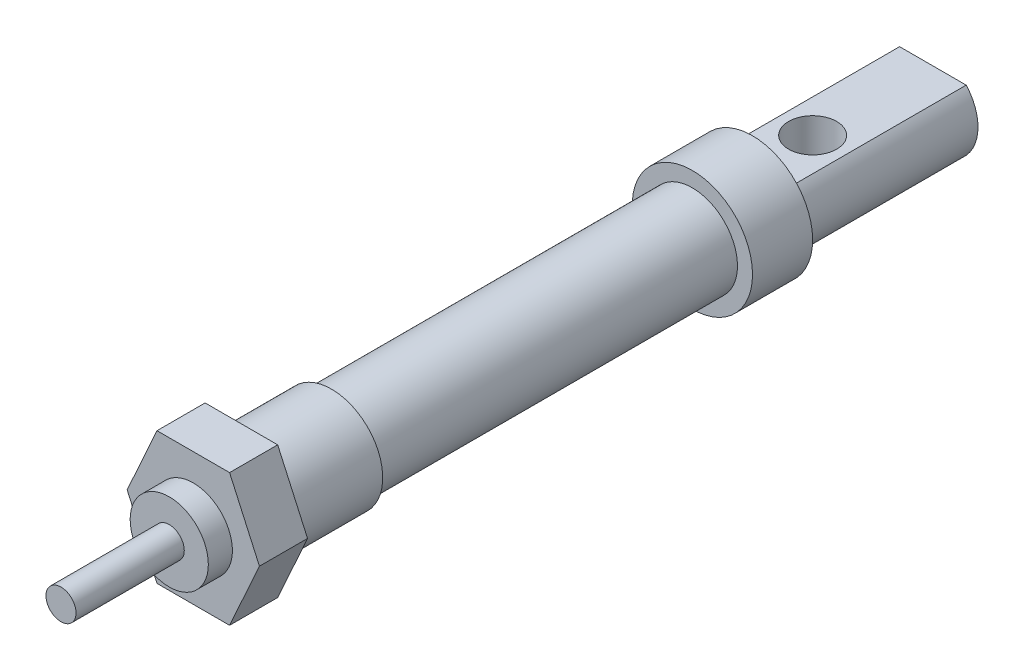
ISO-10303-21;
HEADER;
FILE_DESCRIPTION(('STEP AP214'),'2;1');
FILE_NAME('part.step','',(''),(''),'','','');
FILE_SCHEMA(('AUTOMOTIVE_DESIGN { 1 0 10303 214 1 1 1 1 }'));
ENDSEC;
DATA;
#1=APPLICATION_CONTEXT('core data for automotive mechanical design processes');
#2=APPLICATION_PROTOCOL_DEFINITION('international standard','automotive_design',2000,#1);
#3=PRODUCT_CONTEXT('',#1,'mechanical');
#4=PRODUCT('Part','Part','',(#3));
#5=PRODUCT_RELATED_PRODUCT_CATEGORY('part','',(#4));
#6=PRODUCT_DEFINITION_FORMATION('','',#4);
#7=PRODUCT_DEFINITION_CONTEXT('part definition',#1,'design');
#8=PRODUCT_DEFINITION('design','',#6,#7);
#9=PRODUCT_DEFINITION_SHAPE('','',#8);
#10=(LENGTH_UNIT() NAMED_UNIT(*) SI_UNIT(.MILLI.,.METRE.));
#11=(NAMED_UNIT(*) PLANE_ANGLE_UNIT() SI_UNIT($,.RADIAN.));
#12=(NAMED_UNIT(*) SI_UNIT($,.STERADIAN.) SOLID_ANGLE_UNIT());
#13=UNCERTAINTY_MEASURE_WITH_UNIT(LENGTH_MEASURE(1.E-05),#10,'distance_accuracy_value','');
#14=(GEOMETRIC_REPRESENTATION_CONTEXT(3) GLOBAL_UNCERTAINTY_ASSIGNED_CONTEXT((#13)) GLOBAL_UNIT_ASSIGNED_CONTEXT((#10,
#11,#12)) REPRESENTATION_CONTEXT('',''));
#15=CARTESIAN_POINT('',(0.,0.,0.));
#16=DIRECTION('',(0.,0.,1.));
#17=DIRECTION('',(1.,0.,0.));
#18=AXIS2_PLACEMENT_3D('',#15,#16,#17);
#19=CARTESIAN_POINT('',(0.,0.,38.1));
#20=DIRECTION('',(0.,0.,-1.));
#21=DIRECTION('',(-1.,0.,0.));
#22=AXIS2_PLACEMENT_3D('',#19,#20,#21);
#23=CYLINDRICAL_SURFACE('',#22,9.525);
#24=DIRECTION('',(0.,0.,-1.));
#25=VECTOR('',#24,1.);
#26=CARTESIAN_POINT('',(-7.03347032638822,-6.42307715723674,38.1));
#27=LINE('',#26,#25);
#28=CARTESIAN_POINT('',(-7.03347032638822,-6.42307715723674,38.1));
#29=VERTEX_POINT('',#28);
#30=CARTESIAN_POINT('',(-7.03347032638822,-6.42307715723674,0.));
#31=VERTEX_POINT('',#30);
#32=EDGE_CURVE('E49',#29,#31,#27,.T.);
#33=ORIENTED_EDGE('',*,*,#32,.F.);
#34=CARTESIAN_POINT('',(0.,0.,38.1));
#35=DIRECTION('',(0.,0.,1.));
#36=DIRECTION('',(1.,0.,0.));
#37=AXIS2_PLACEMENT_3D('',#34,#35,#36);
#38=CIRCLE('',#37,9.525);
#39=CARTESIAN_POINT('',(-7.03347032638822,6.42307715723674,38.1));
#40=VERTEX_POINT('',#39);
#41=EDGE_CURVE('E41',#40,#29,#38,.T.);
#42=ORIENTED_EDGE('',*,*,#41,.F.);
#43=DIRECTION('',(0.,0.,-1.));
#44=VECTOR('',#43,1.);
#45=CARTESIAN_POINT('',(-7.03347032638822,6.42307715723674,38.1));
#46=LINE('',#45,#44);
#47=CARTESIAN_POINT('',(-7.03347032638822,6.42307715723674,0.));
#48=VERTEX_POINT('',#47);
#49=EDGE_CURVE('E136',#40,#48,#46,.T.);
#50=ORIENTED_EDGE('',*,*,#49,.T.);
#51=CARTESIAN_POINT('',(0.,0.,0.));
#52=DIRECTION('',(0.,0.,1.));
#53=DIRECTION('',(1.,0.,0.));
#54=AXIS2_PLACEMENT_3D('',#51,#52,#53);
#55=CIRCLE('',#54,9.525);
#56=EDGE_CURVE('E127',#48,#31,#55,.T.);
#57=ORIENTED_EDGE('',*,*,#56,.T.);
#58=EDGE_LOOP('',(#33,#42,#50,#57));
#59=FACE_BOUND('',#58,.T.);
#60=ADVANCED_FACE('F33',(#59),#23,.T.);
#61=DIRECTION('',(0.,0.,-1.));
#62=VECTOR('',#61,1.);
#63=CARTESIAN_POINT('',(7.03347032638822,-6.42307715723674,38.1));
#64=LINE('',#63,#62);
#65=CARTESIAN_POINT('',(7.03347032638822,-6.42307715723674,38.1));
#66=VERTEX_POINT('',#65);
#67=CARTESIAN_POINT('',(7.03347032638822,-6.42307715723674,0.));
#68=VERTEX_POINT('',#67);
#69=EDGE_CURVE('E120',#66,#68,#64,.T.);
#70=ORIENTED_EDGE('',*,*,#69,.T.);
#71=CARTESIAN_POINT('',(7.03347032638822,6.42307715723674,0.));
#72=VERTEX_POINT('',#71);
#73=EDGE_CURVE('E57',#68,#72,#55,.T.);
#74=ORIENTED_EDGE('',*,*,#73,.T.);
#75=DIRECTION('',(0.,0.,-1.));
#76=VECTOR('',#75,1.);
#77=CARTESIAN_POINT('',(7.03347032638822,6.42307715723674,38.1));
#78=LINE('',#77,#76);
#79=CARTESIAN_POINT('',(7.03347032638822,6.42307715723674,38.1));
#80=VERTEX_POINT('',#79);
#81=EDGE_CURVE('E126',#80,#72,#78,.T.);
#82=ORIENTED_EDGE('',*,*,#81,.F.);
#83=EDGE_CURVE('E117',#66,#80,#38,.T.);
#84=ORIENTED_EDGE('',*,*,#83,.F.);
#85=EDGE_LOOP('',(#70,#74,#82,#84));
#86=FACE_BOUND('',#85,.T.);
#87=ADVANCED_FACE('F125',(#86),#23,.T.);
#88=CARTESIAN_POINT('',(0.,0.,0.));
#89=DIRECTION('',(0.,0.,1.));
#90=DIRECTION('',(1.,0.,0.));
#91=AXIS2_PLACEMENT_3D('',#88,#89,#90);
#92=PLANE('',#91);
#93=DIRECTION('',(-1.,0.,0.));
#94=VECTOR('',#93,1.);
#95=CARTESIAN_POINT('',(7.03347032638822,-6.42307715723674,0.));
#96=LINE('',#95,#94);
#97=EDGE_CURVE('E121',#68,#31,#96,.T.);
#98=ORIENTED_EDGE('',*,*,#97,.T.);
#99=ORIENTED_EDGE('',*,*,#56,.F.);
#100=DIRECTION('',(-1.,0.,0.));
#101=VECTOR('',#100,1.);
#102=CARTESIAN_POINT('',(7.03347032638822,6.42307715723674,0.));
#103=LINE('',#102,#101);
#104=EDGE_CURVE('E146',#72,#48,#103,.T.);
#105=ORIENTED_EDGE('',*,*,#104,.F.);
#106=ORIENTED_EDGE('',*,*,#73,.F.);
#107=EDGE_LOOP('',(#98,#99,#105,#106));
#108=FACE_BOUND('',#107,.T.);
#109=ADVANCED_FACE('F245',(#108),#92,.F.);
#110=CARTESIAN_POINT('',(0.,22.86,25.4));
#111=DIRECTION('',(0.,-1.,0.));
#112=DIRECTION('',(0.,0.,-1.));
#113=AXIS2_PLACEMENT_3D('',#110,#111,#112);
#114=CYLINDRICAL_SURFACE('',#113,5.08);
#115=CARTESIAN_POINT('',(0.,6.42307715723674,25.4));
#116=DIRECTION('',(0.,-1.,0.));
#117=DIRECTION('',(0.,0.,-1.));
#118=AXIS2_PLACEMENT_3D('',#115,#116,#117);
#119=CIRCLE('',#118,5.08);
#120=CARTESIAN_POINT('',(0.,6.42307715723674,20.32));
#121=VERTEX_POINT('',#120);
#122=EDGE_CURVE('E134',#121,#121,#119,.T.);
#123=CARTESIAN_POINT('',(0.,-6.42307715723674,25.4));
#124=DIRECTION('',(0.,-1.,0.));
#125=DIRECTION('',(0.,0.,-1.));
#126=AXIS2_PLACEMENT_3D('',#123,#124,#125);
#127=CIRCLE('',#126,5.08);
#128=CARTESIAN_POINT('',(0.,-6.42307715723674,20.32));
#129=VERTEX_POINT('',#128);
#130=EDGE_CURVE('E36',#129,#129,#127,.T.);
#131=CARTESIAN_POINT('',(0.,6.42307715723674,20.32));
#132=CARTESIAN_POINT('',(0.,6.2892630497943,20.32));
#133=CARTESIAN_POINT('',(0.,6.15544894235187,20.32));
#134=CARTESIAN_POINT('',(0.,5.88782072746701,20.32));
#135=CARTESIAN_POINT('',(0.,5.75400662002458,20.32));
#136=CARTESIAN_POINT('',(0.,5.48637840513971,20.32));
#137=CARTESIAN_POINT('',(0.,5.35256429769728,20.32));
#138=CARTESIAN_POINT('',(0.,5.08493608281242,20.32));
#139=CARTESIAN_POINT('',(0.,4.95112197536998,20.32));
#140=CARTESIAN_POINT('',(0.,4.68349376048512,20.32));
#141=CARTESIAN_POINT('',(0.,4.54967965304269,20.32));
#142=CARTESIAN_POINT('',(0.,4.28205143815782,20.32));
#143=CARTESIAN_POINT('',(0.,4.14823733071539,20.32));
#144=CARTESIAN_POINT('',(0.,3.88060911583053,20.32));
#145=CARTESIAN_POINT('',(0.,3.7467950083881,20.32));
#146=CARTESIAN_POINT('',(0.,3.47916679350323,20.32));
#147=CARTESIAN_POINT('',(0.,3.3453526860608,20.32));
#148=CARTESIAN_POINT('',(0.,3.07772447117594,20.32));
#149=CARTESIAN_POINT('',(0.,2.9439103637335,20.32));
#150=CARTESIAN_POINT('',(0.,2.67628214884864,20.32));
#151=CARTESIAN_POINT('',(0.,2.54246804140621,20.32));
#152=CARTESIAN_POINT('',(0.,2.27483982652135,20.32));
#153=CARTESIAN_POINT('',(0.,2.14102571907891,20.32));
#154=CARTESIAN_POINT('',(0.,1.87339750419405,20.32));
#155=CARTESIAN_POINT('',(0.,1.73958339675162,20.32));
#156=CARTESIAN_POINT('',(0.,1.47195518186675,20.32));
#157=CARTESIAN_POINT('',(0.,1.33814107442432,20.32));
#158=CARTESIAN_POINT('',(0.,1.07051285953946,20.32));
#159=CARTESIAN_POINT('',(0.,0.936698752097023,20.32));
#160=CARTESIAN_POINT('',(0.,0.669070537212159,20.32));
#161=CARTESIAN_POINT('',(0.,0.535256429769727,20.32));
#162=CARTESIAN_POINT('',(0.,0.267628214884863,20.32));
#163=CARTESIAN_POINT('',(0.,0.133814107442432,20.32));
#164=CARTESIAN_POINT('',(0.,-0.133814107442432,20.32));
#165=CARTESIAN_POINT('',(0.,-0.267628214884863,20.32));
#166=CARTESIAN_POINT('',(0.,-0.535256429769727,20.32));
#167=CARTESIAN_POINT('',(0.,-0.669070537212159,20.32));
#168=CARTESIAN_POINT('',(0.,-0.936698752097023,20.32));
#169=CARTESIAN_POINT('',(0.,-1.07051285953946,20.32));
#170=CARTESIAN_POINT('',(0.,-1.33814107442432,20.32));
#171=CARTESIAN_POINT('',(0.,-1.47195518186675,20.32));
#172=CARTESIAN_POINT('',(0.,-1.73958339675162,20.32));
#173=CARTESIAN_POINT('',(0.,-1.87339750419405,20.32));
#174=CARTESIAN_POINT('',(0.,-2.14102571907891,20.32));
#175=CARTESIAN_POINT('',(0.,-2.27483982652135,20.32));
#176=CARTESIAN_POINT('',(0.,-2.54246804140621,20.32));
#177=CARTESIAN_POINT('',(0.,-2.67628214884864,20.32));
#178=CARTESIAN_POINT('',(0.,-2.9439103637335,20.32));
#179=CARTESIAN_POINT('',(0.,-3.07772447117594,20.32));
#180=CARTESIAN_POINT('',(0.,-3.3453526860608,20.32));
#181=CARTESIAN_POINT('',(0.,-3.47916679350323,20.32));
#182=CARTESIAN_POINT('',(0.,-3.7467950083881,20.32));
#183=CARTESIAN_POINT('',(0.,-3.88060911583053,20.32));
#184=CARTESIAN_POINT('',(0.,-4.14823733071539,20.32));
#185=CARTESIAN_POINT('',(0.,-4.28205143815782,20.32));
#186=CARTESIAN_POINT('',(0.,-4.54967965304269,20.32));
#187=CARTESIAN_POINT('',(0.,-4.68349376048512,20.32));
#188=CARTESIAN_POINT('',(0.,-4.95112197536998,20.32));
#189=CARTESIAN_POINT('',(0.,-5.08493608281242,20.32));
#190=CARTESIAN_POINT('',(0.,-5.35256429769728,20.32));
#191=CARTESIAN_POINT('',(0.,-5.48637840513971,20.32));
#192=CARTESIAN_POINT('',(0.,-5.75400662002458,20.32));
#193=CARTESIAN_POINT('',(0.,-5.88782072746701,20.32));
#194=CARTESIAN_POINT('',(0.,-6.15544894235187,20.32));
#195=CARTESIAN_POINT('',(0.,-6.2892630497943,20.32));
#196=CARTESIAN_POINT('',(0.,-6.42307715723674,20.32));
#197=B_SPLINE_CURVE_WITH_KNOTS('',3,(#131,#132,#133,#134,#135,#136,#137,#138,#139,#140,#141,
#142,#143,#144,#145,#146,#147,#148,#149,#150,#151,#152,#153,#154,#155,#156,#157,#158,#159,#160,
#161,#162,#163,#164,#165,#166,#167,#168,#169,#170,#171,#172,#173,#174,#175,#176,#177,#178,#179,
#180,#181,#182,#183,#184,#185,#186,#187,#188,#189,#190,#191,#192,#193,#194,#195,#196),
.UNSPECIFIED.,.F.,.F.,(4,2,2,2,2,2,2,2,2,2,2,2,2,2,2,2,2,2,2,2,2,2,2,2,2,2,2,2,2,2,2,2,4),(0.,
0.401442322327295,0.80288464465459,1.20432696698189,1.60576928930918,2.00721161163648,
2.40865393396378,2.81009625629107,3.21153857861837,3.61298090094566,4.01442322327296,
4.41586554560026,4.81730786792755,5.21875019025485,5.62019251258215,6.02163483490944,
6.42307715723674,6.82451947956403,7.22596180189133,7.62740412421863,8.02884644654592,
8.43028876887322,8.83173109120052,9.23317341352781,9.63461573585511,10.0360580581824,
10.4375003805097,10.838942702837,11.2403850251643,11.6418273474916,12.0432696698189,
12.4447119921462,12.8461543144735),.UNSPECIFIED.);
#198=EDGE_CURVE('BSEAM265',#121,#129,#197,.T.);
#199=ORIENTED_EDGE('',*,*,#122,.F.);
#200=ORIENTED_EDGE('',*,*,#130,.T.);
#201=ORIENTED_EDGE('',*,*,#198,.T.);
#202=ORIENTED_EDGE('',*,*,#198,.F.);
#203=EDGE_LOOP('',(#199,#201,#200,#202));
#204=FACE_BOUND('',#203,.T.);
#205=ADVANCED_FACE('F265',(#204),#114,.F.);
#206=CARTESIAN_POINT('',(0.,0.,50.8));
#207=DIRECTION('',(0.,0.,-1.));
#208=DIRECTION('',(-1.,0.,0.));
#209=AXIS2_PLACEMENT_3D('',#206,#207,#208);
#210=CYLINDRICAL_SURFACE('',#209,12.7);
#211=CARTESIAN_POINT('',(0.,0.,50.8));
#212=DIRECTION('',(0.,0.,1.));
#213=DIRECTION('',(1.,0.,0.));
#214=AXIS2_PLACEMENT_3D('',#211,#212,#213);
#215=CIRCLE('',#214,12.7);
#216=CARTESIAN_POINT('',(12.7,0.,50.8));
#217=VERTEX_POINT('',#216);
#218=EDGE_CURVE('E217',#217,#217,#215,.T.);
#219=ORIENTED_EDGE('',*,*,#218,.F.);
#220=EDGE_LOOP('',(#219));
#221=FACE_BOUND('',#220,.T.);
#222=CARTESIAN_POINT('',(0.,0.,38.1));
#223=DIRECTION('',(0.,0.,1.));
#224=DIRECTION('',(1.,0.,0.));
#225=AXIS2_PLACEMENT_3D('',#222,#223,#224);
#226=CIRCLE('',#225,12.7);
#227=CARTESIAN_POINT('',(12.7,0.,38.1));
#228=VERTEX_POINT('',#227);
#229=EDGE_CURVE('E132',#228,#228,#226,.T.);
#230=ORIENTED_EDGE('',*,*,#229,.T.);
#231=EDGE_LOOP('',(#230));
#232=FACE_BOUND('',#231,.T.);
#233=ADVANCED_FACE('F224',(#221,#232),#210,.T.);
#234=CARTESIAN_POINT('',(0.,0.,50.8));
#235=DIRECTION('',(0.,0.,1.));
#236=DIRECTION('',(1.,0.,0.));
#237=AXIS2_PLACEMENT_3D('',#234,#235,#236);
#238=PLANE('',#237);
#239=CARTESIAN_POINT('',(0.,0.,50.8));
#240=DIRECTION('',(0.,0.,1.));
#241=DIRECTION('',(1.,0.,0.));
#242=AXIS2_PLACEMENT_3D('',#239,#240,#241);
#243=CIRCLE('',#242,9.525);
#244=CARTESIAN_POINT('',(-9.525,0.,50.8));
#245=VERTEX_POINT('',#244);
#246=EDGE_CURVE('E210',#245,#245,#243,.T.);
#247=ORIENTED_EDGE('',*,*,#246,.F.);
#248=EDGE_LOOP('',(#247));
#249=FACE_BOUND('',#248,.T.);
#250=ORIENTED_EDGE('',*,*,#218,.T.);
#251=EDGE_LOOP('',(#250));
#252=FACE_BOUND('',#251,.T.);
#253=ADVANCED_FACE('F228',(#249,#252),#238,.T.);
#254=CARTESIAN_POINT('',(0.,0.,38.1));
#255=DIRECTION('',(0.,0.,1.));
#256=DIRECTION('',(1.,0.,0.));
#257=AXIS2_PLACEMENT_3D('',#254,#255,#256);
#258=PLANE('',#257);
#259=ORIENTED_EDGE('',*,*,#229,.F.);
#260=EDGE_LOOP('',(#259));
#261=FACE_BOUND('',#260,.T.);
#262=ORIENTED_EDGE('',*,*,#41,.T.);
#263=DIRECTION('',(-1.,0.,0.));
#264=VECTOR('',#263,1.);
#265=CARTESIAN_POINT('',(7.03347032638822,-6.42307715723674,38.1));
#266=LINE('',#265,#264);
#267=EDGE_CURVE('E112',#66,#29,#266,.T.);
#268=ORIENTED_EDGE('',*,*,#267,.F.);
#269=ORIENTED_EDGE('',*,*,#83,.T.);
#270=DIRECTION('',(-1.,0.,0.));
#271=VECTOR('',#270,1.);
#272=CARTESIAN_POINT('',(7.03347032638822,6.42307715723674,38.1));
#273=LINE('',#272,#271);
#274=EDGE_CURVE('E142',#80,#40,#273,.T.);
#275=ORIENTED_EDGE('',*,*,#274,.T.);
#276=EDGE_LOOP('',(#262,#268,#269,#275));
#277=FACE_BOUND('',#276,.T.);
#278=ADVANCED_FACE('F114',(#261,#277),#258,.F.);
#279=CARTESIAN_POINT('',(0.,0.,127.));
#280=DIRECTION('',(0.,0.,-1.));
#281=DIRECTION('',(-1.,0.,0.));
#282=AXIS2_PLACEMENT_3D('',#279,#280,#281);
#283=CYLINDRICAL_SURFACE('',#282,9.525);
#284=CARTESIAN_POINT('',(0.,0.,127.));
#285=DIRECTION('',(0.,0.,1.));
#286=DIRECTION('',(1.,0.,0.));
#287=AXIS2_PLACEMENT_3D('',#284,#285,#286);
#288=CIRCLE('',#287,9.525);
#289=CARTESIAN_POINT('',(-9.525,0.,127.));
#290=VERTEX_POINT('',#289);
#291=EDGE_CURVE('E213',#290,#290,#288,.T.);
#292=CARTESIAN_POINT('',(-9.525,0.,127.));
#293=CARTESIAN_POINT('',(-9.525,0.,126.20625));
#294=CARTESIAN_POINT('',(-9.525,0.,125.4125));
#295=CARTESIAN_POINT('',(-9.525,0.,123.825));
#296=CARTESIAN_POINT('',(-9.525,0.,123.03125));
#297=CARTESIAN_POINT('',(-9.525,0.,121.44375));
#298=CARTESIAN_POINT('',(-9.525,0.,120.65));
#299=CARTESIAN_POINT('',(-9.525,0.,119.0625));
#300=CARTESIAN_POINT('',(-9.525,0.,118.26875));
#301=CARTESIAN_POINT('',(-9.525,0.,116.68125));
#302=CARTESIAN_POINT('',(-9.525,0.,115.8875));
#303=CARTESIAN_POINT('',(-9.525,0.,114.3));
#304=CARTESIAN_POINT('',(-9.525,0.,113.50625));
#305=CARTESIAN_POINT('',(-9.525,0.,111.91875));
#306=CARTESIAN_POINT('',(-9.525,0.,111.125));
#307=CARTESIAN_POINT('',(-9.525,0.,109.5375));
#308=CARTESIAN_POINT('',(-9.525,0.,108.74375));
#309=CARTESIAN_POINT('',(-9.525,0.,107.15625));
#310=CARTESIAN_POINT('',(-9.525,0.,106.3625));
#311=CARTESIAN_POINT('',(-9.525,0.,104.775));
#312=CARTESIAN_POINT('',(-9.525,0.,103.98125));
#313=CARTESIAN_POINT('',(-9.525,0.,102.39375));
#314=CARTESIAN_POINT('',(-9.525,0.,101.6));
#315=CARTESIAN_POINT('',(-9.525,0.,100.0125));
#316=CARTESIAN_POINT('',(-9.525,0.,99.21875));
#317=CARTESIAN_POINT('',(-9.525,0.,97.63125));
#318=CARTESIAN_POINT('',(-9.525,0.,96.8375));
#319=CARTESIAN_POINT('',(-9.525,0.,95.25));
#320=CARTESIAN_POINT('',(-9.525,0.,94.45625));
#321=CARTESIAN_POINT('',(-9.525,0.,92.86875));
#322=CARTESIAN_POINT('',(-9.525,0.,92.075));
#323=CARTESIAN_POINT('',(-9.525,0.,90.4875));
#324=CARTESIAN_POINT('',(-9.525,0.,89.69375));
#325=CARTESIAN_POINT('',(-9.525,0.,88.10625));
#326=CARTESIAN_POINT('',(-9.525,0.,87.3125));
#327=CARTESIAN_POINT('',(-9.525,0.,85.725));
#328=CARTESIAN_POINT('',(-9.525,0.,84.93125));
#329=CARTESIAN_POINT('',(-9.525,0.,83.34375));
#330=CARTESIAN_POINT('',(-9.525,0.,82.55));
#331=CARTESIAN_POINT('',(-9.525,0.,80.9625));
#332=CARTESIAN_POINT('',(-9.525,0.,80.16875));
#333=CARTESIAN_POINT('',(-9.525,0.,78.58125));
#334=CARTESIAN_POINT('',(-9.525,0.,77.7875));
#335=CARTESIAN_POINT('',(-9.525,0.,76.2));
#336=CARTESIAN_POINT('',(-9.525,0.,75.40625));
#337=CARTESIAN_POINT('',(-9.525,0.,73.81875));
#338=CARTESIAN_POINT('',(-9.525,0.,73.025));
#339=CARTESIAN_POINT('',(-9.525,0.,71.4375));
#340=CARTESIAN_POINT('',(-9.525,0.,70.64375));
#341=CARTESIAN_POINT('',(-9.525,0.,69.05625));
#342=CARTESIAN_POINT('',(-9.525,0.,68.2625));
#343=CARTESIAN_POINT('',(-9.525,0.,66.675));
#344=CARTESIAN_POINT('',(-9.525,0.,65.88125));
#345=CARTESIAN_POINT('',(-9.525,0.,64.29375));
#346=CARTESIAN_POINT('',(-9.525,0.,63.5));
#347=CARTESIAN_POINT('',(-9.525,0.,61.9125));
#348=CARTESIAN_POINT('',(-9.525,0.,61.11875));
#349=CARTESIAN_POINT('',(-9.525,0.,59.53125));
#350=CARTESIAN_POINT('',(-9.525,0.,58.7375));
#351=CARTESIAN_POINT('',(-9.525,0.,57.15));
#352=CARTESIAN_POINT('',(-9.525,0.,56.35625));
#353=CARTESIAN_POINT('',(-9.525,0.,54.76875));
#354=CARTESIAN_POINT('',(-9.525,0.,53.975));
#355=CARTESIAN_POINT('',(-9.525,0.,52.3875));
#356=CARTESIAN_POINT('',(-9.525,0.,51.59375));
#357=CARTESIAN_POINT('',(-9.525,0.,50.8));
#358=B_SPLINE_CURVE_WITH_KNOTS('',3,(#292,#293,#294,#295,#296,#297,#298,#299,#300,#301,#302,
#303,#304,#305,#306,#307,#308,#309,#310,#311,#312,#313,#314,#315,#316,#317,#318,#319,#320,#321,
#322,#323,#324,#325,#326,#327,#328,#329,#330,#331,#332,#333,#334,#335,#336,#337,#338,#339,#340,
#341,#342,#343,#344,#345,#346,#347,#348,#349,#350,#351,#352,#353,#354,#355,#356,#357),
.UNSPECIFIED.,.F.,.F.,(4,2,2,2,2,2,2,2,2,2,2,2,2,2,2,2,2,2,2,2,2,2,2,2,2,2,2,2,2,2,2,2,4),(0.,
2.38125000000002,4.76250000000002,7.14375000000002,9.52500000000001,11.90625,14.2875,16.66875,
19.05,21.43125,23.8125,26.19375,28.575,30.95625,33.3375,35.71875,38.1,40.48125,42.8625,45.24375,
47.625,50.00625,52.3875,54.76875,57.15,59.53125,61.9125,64.29375,66.675,69.05625,71.4375,
73.81875,76.2),.UNSPECIFIED.);
#359=EDGE_CURVE('BSEAM227',#290,#245,#358,.T.);
#360=ORIENTED_EDGE('',*,*,#291,.F.);
#361=ORIENTED_EDGE('',*,*,#246,.T.);
#362=ORIENTED_EDGE('',*,*,#359,.T.);
#363=ORIENTED_EDGE('',*,*,#359,.F.);
#364=EDGE_LOOP('',(#360,#362,#361,#363));
#365=FACE_BOUND('',#364,.T.);
#366=ADVANCED_FACE('F227',(#365),#283,.T.);
#367=CARTESIAN_POINT('',(0.,0.,146.05));
#368=DIRECTION('',(0.,0.,-1.));
#369=DIRECTION('',(-1.,0.,0.));
#370=AXIS2_PLACEMENT_3D('',#367,#368,#369);
#371=CYLINDRICAL_SURFACE('',#370,10.7950000000001);
#372=CARTESIAN_POINT('',(0.,0.,146.05));
#373=DIRECTION('',(0.,0.,1.));
#374=DIRECTION('',(1.,0.,0.));
#375=AXIS2_PLACEMENT_3D('',#372,#373,#374);
#376=CIRCLE('',#375,10.7950000000001);
#377=CARTESIAN_POINT('',(-10.7950000000001,0.,146.05));
#378=VERTEX_POINT('',#377);
#379=EDGE_CURVE('E207',#378,#378,#376,.T.);
#380=CARTESIAN_POINT('',(0.,0.,127.));
#381=DIRECTION('',(0.,0.,1.));
#382=DIRECTION('',(1.,0.,0.));
#383=AXIS2_PLACEMENT_3D('',#380,#381,#382);
#384=CIRCLE('',#383,10.7950000000001);
#385=CARTESIAN_POINT('',(-10.7950000000001,0.,127.));
#386=VERTEX_POINT('',#385);
#387=EDGE_CURVE('E197',#386,#386,#384,.T.);
#388=CARTESIAN_POINT('',(-10.7950000000001,0.,146.05));
#389=CARTESIAN_POINT('',(-10.7950000000001,0.,145.8515625));
#390=CARTESIAN_POINT('',(-10.7950000000001,0.,145.653125));
#391=CARTESIAN_POINT('',(-10.7950000000001,0.,145.25625));
#392=CARTESIAN_POINT('',(-10.7950000000001,0.,145.0578125));
#393=CARTESIAN_POINT('',(-10.7950000000001,0.,144.6609375));
#394=CARTESIAN_POINT('',(-10.7950000000001,0.,144.4625));
#395=CARTESIAN_POINT('',(-10.7950000000001,0.,144.065625));
#396=CARTESIAN_POINT('',(-10.7950000000001,0.,143.8671875));
#397=CARTESIAN_POINT('',(-10.7950000000001,0.,143.4703125));
#398=CARTESIAN_POINT('',(-10.7950000000001,0.,143.271875));
#399=CARTESIAN_POINT('',(-10.7950000000001,0.,142.875));
#400=CARTESIAN_POINT('',(-10.7950000000001,0.,142.6765625));
#401=CARTESIAN_POINT('',(-10.7950000000001,0.,142.2796875));
#402=CARTESIAN_POINT('',(-10.7950000000001,0.,142.08125));
#403=CARTESIAN_POINT('',(-10.7950000000001,0.,141.684375));
#404=CARTESIAN_POINT('',(-10.7950000000001,0.,141.4859375));
#405=CARTESIAN_POINT('',(-10.7950000000001,0.,141.0890625));
#406=CARTESIAN_POINT('',(-10.7950000000001,0.,140.890625));
#407=CARTESIAN_POINT('',(-10.7950000000001,0.,140.49375));
#408=CARTESIAN_POINT('',(-10.7950000000001,0.,140.2953125));
#409=CARTESIAN_POINT('',(-10.7950000000001,0.,139.8984375));
#410=CARTESIAN_POINT('',(-10.7950000000001,0.,139.7));
#411=CARTESIAN_POINT('',(-10.7950000000001,0.,139.303125));
#412=CARTESIAN_POINT('',(-10.7950000000001,0.,139.1046875));
#413=CARTESIAN_POINT('',(-10.7950000000001,0.,138.7078125));
#414=CARTESIAN_POINT('',(-10.7950000000001,0.,138.509375));
#415=CARTESIAN_POINT('',(-10.7950000000001,0.,138.1125));
#416=CARTESIAN_POINT('',(-10.7950000000001,0.,137.9140625));
#417=CARTESIAN_POINT('',(-10.7950000000001,0.,137.5171875));
#418=CARTESIAN_POINT('',(-10.7950000000001,0.,137.31875));
#419=CARTESIAN_POINT('',(-10.7950000000001,0.,136.921875));
#420=CARTESIAN_POINT('',(-10.7950000000001,0.,136.7234375));
#421=CARTESIAN_POINT('',(-10.7950000000001,0.,136.3265625));
#422=CARTESIAN_POINT('',(-10.7950000000001,0.,136.128125));
#423=CARTESIAN_POINT('',(-10.7950000000001,0.,135.73125));
#424=CARTESIAN_POINT('',(-10.7950000000001,0.,135.5328125));
#425=CARTESIAN_POINT('',(-10.7950000000001,0.,135.1359375));
#426=CARTESIAN_POINT('',(-10.7950000000001,0.,134.9375));
#427=CARTESIAN_POINT('',(-10.7950000000001,0.,134.540625));
#428=CARTESIAN_POINT('',(-10.7950000000001,0.,134.3421875));
#429=CARTESIAN_POINT('',(-10.7950000000001,0.,133.9453125));
#430=CARTESIAN_POINT('',(-10.7950000000001,0.,133.746875));
#431=CARTESIAN_POINT('',(-10.7950000000001,0.,133.35));
#432=CARTESIAN_POINT('',(-10.7950000000001,0.,133.1515625));
#433=CARTESIAN_POINT('',(-10.7950000000001,0.,132.7546875));
#434=CARTESIAN_POINT('',(-10.7950000000001,0.,132.55625));
#435=CARTESIAN_POINT('',(-10.7950000000001,0.,132.159375));
#436=CARTESIAN_POINT('',(-10.7950000000001,0.,131.9609375));
#437=CARTESIAN_POINT('',(-10.7950000000001,0.,131.5640625));
#438=CARTESIAN_POINT('',(-10.7950000000001,0.,131.365625));
#439=CARTESIAN_POINT('',(-10.7950000000001,0.,130.96875));
#440=CARTESIAN_POINT('',(-10.7950000000001,0.,130.7703125));
#441=CARTESIAN_POINT('',(-10.7950000000001,0.,130.3734375));
#442=CARTESIAN_POINT('',(-10.7950000000001,0.,130.175));
#443=CARTESIAN_POINT('',(-10.7950000000001,0.,129.778125));
#444=CARTESIAN_POINT('',(-10.7950000000001,0.,129.5796875));
#445=CARTESIAN_POINT('',(-10.7950000000001,0.,129.1828125));
#446=CARTESIAN_POINT('',(-10.7950000000001,0.,128.984375));
#447=CARTESIAN_POINT('',(-10.7950000000001,0.,128.5875));
#448=CARTESIAN_POINT('',(-10.7950000000001,0.,128.3890625));
#449=CARTESIAN_POINT('',(-10.7950000000001,0.,127.9921875));
#450=CARTESIAN_POINT('',(-10.7950000000001,0.,127.79375));
#451=CARTESIAN_POINT('',(-10.7950000000001,0.,127.396875));
#452=CARTESIAN_POINT('',(-10.7950000000001,0.,127.1984375));
#453=CARTESIAN_POINT('',(-10.7950000000001,0.,127.));
#454=B_SPLINE_CURVE_WITH_KNOTS('',3,(#388,#389,#390,#391,#392,#393,#394,#395,#396,#397,#398,
#399,#400,#401,#402,#403,#404,#405,#406,#407,#408,#409,#410,#411,#412,#413,#414,#415,#416,#417,
#418,#419,#420,#421,#422,#423,#424,#425,#426,#427,#428,#429,#430,#431,#432,#433,#434,#435,#436,
#437,#438,#439,#440,#441,#442,#443,#444,#445,#446,#447,#448,#449,#450,#451,#452,#453),
.UNSPECIFIED.,.F.,.F.,(4,2,2,2,2,2,2,2,2,2,2,2,2,2,2,2,2,2,2,2,2,2,2,2,2,2,2,2,2,2,2,2,4),(0.,
0.5953125,1.190625,1.7859375,2.38125,2.9765625,3.571875,4.1671875,4.7625,5.3578125,5.953125,
6.5484375,7.14375,7.7390625,8.334375,8.92968750000001,9.52500000000001,10.1203125,10.715625,
11.3109375,11.90625,12.5015625,13.096875,13.6921875,14.2875,14.8828125,15.478125,16.0734375,
16.66875,17.2640625,17.859375,18.4546875,19.05),.UNSPECIFIED.);
#455=EDGE_CURVE('BSEAM234',#378,#386,#454,.T.);
#456=ORIENTED_EDGE('',*,*,#379,.F.);
#457=ORIENTED_EDGE('',*,*,#387,.T.);
#458=ORIENTED_EDGE('',*,*,#455,.T.);
#459=ORIENTED_EDGE('',*,*,#455,.F.);
#460=EDGE_LOOP('',(#456,#458,#457,#459));
#461=FACE_BOUND('',#460,.T.);
#462=ADVANCED_FACE('F234',(#461),#371,.T.);
#463=CARTESIAN_POINT('',(0.,0.,127.));
#464=DIRECTION('',(0.,0.,1.));
#465=DIRECTION('',(1.,0.,0.));
#466=AXIS2_PLACEMENT_3D('',#463,#464,#465);
#467=PLANE('',#466);
#468=ORIENTED_EDGE('',*,*,#291,.T.);
#469=EDGE_LOOP('',(#468));
#470=FACE_BOUND('',#469,.T.);
#471=ORIENTED_EDGE('',*,*,#387,.F.);
#472=EDGE_LOOP('',(#471));
#473=FACE_BOUND('',#472,.T.);
#474=ADVANCED_FACE('F311',(#470,#473),#467,.F.);
#475=CARTESIAN_POINT('',(-7.66371527185745,13.97,156.21));
#476=DIRECTION('',(0.,1.,0.));
#477=DIRECTION('',(-1.,0.,0.));
#478=AXIS2_PLACEMENT_3D('',#475,#476,#477);
#479=PLANE('',#478);
#480=DIRECTION('',(1.,0.,0.));
#481=VECTOR('',#480,1.);
#482=CARTESIAN_POINT('',(-7.66371527185745,13.97,146.05));
#483=LINE('',#482,#481);
#484=CARTESIAN_POINT('',(-7.66371527185745,13.97,146.05));
#485=VERTEX_POINT('',#484);
#486=CARTESIAN_POINT('',(7.66371527185745,13.97,146.05));
#487=VERTEX_POINT('',#486);
#488=EDGE_CURVE('E158',#485,#487,#483,.T.);
#489=ORIENTED_EDGE('',*,*,#488,.F.);
#490=DIRECTION('',(0.,0.,-1.));
#491=VECTOR('',#490,1.);
#492=CARTESIAN_POINT('',(-7.66371527185745,13.97,156.21));
#493=LINE('',#492,#491);
#494=CARTESIAN_POINT('',(-7.66371527185745,13.97,156.21));
#495=VERTEX_POINT('',#494);
#496=EDGE_CURVE('E195',#495,#485,#493,.T.);
#497=ORIENTED_EDGE('',*,*,#496,.F.);
#498=DIRECTION('',(1.,0.,0.));
#499=VECTOR('',#498,1.);
#500=CARTESIAN_POINT('',(-7.66371527185745,13.97,156.21));
#501=LINE('',#500,#499);
#502=CARTESIAN_POINT('',(7.66371527185745,13.97,156.21));
#503=VERTEX_POINT('',#502);
#504=EDGE_CURVE('E159',#495,#503,#501,.T.);
#505=ORIENTED_EDGE('',*,*,#504,.T.);
#506=DIRECTION('',(0.,0.,-1.));
#507=VECTOR('',#506,1.);
#508=CARTESIAN_POINT('',(7.66371527185745,13.97,156.21));
#509=LINE('',#508,#507);
#510=EDGE_CURVE('E178',#503,#487,#509,.T.);
#511=ORIENTED_EDGE('',*,*,#510,.T.);
#512=EDGE_LOOP('',(#489,#497,#505,#511));
#513=FACE_BOUND('',#512,.T.);
#514=ADVANCED_FACE('F293',(#513),#479,.T.);
#515=CARTESIAN_POINT('',(-13.97,0.,156.21));
#516=DIRECTION('',(-0.911437827766148,0.411437827766148,0.));
#517=DIRECTION('',(-0.411437827766148,-0.911437827766148,0.));
#518=AXIS2_PLACEMENT_3D('',#515,#516,#517);
#519=PLANE('',#518);
#520=DIRECTION('',(0.411437827766148,0.911437827766148,0.));
#521=VECTOR('',#520,1.);
#522=CARTESIAN_POINT('',(-13.97,0.,146.05));
#523=LINE('',#522,#521);
#524=CARTESIAN_POINT('',(-13.97,0.,146.05));
#525=VERTEX_POINT('',#524);
#526=EDGE_CURVE('E163',#525,#485,#523,.T.);
#527=ORIENTED_EDGE('',*,*,#526,.F.);
#528=DIRECTION('',(0.,0.,-1.));
#529=VECTOR('',#528,1.);
#530=CARTESIAN_POINT('',(-13.97,0.,156.21));
#531=LINE('',#530,#529);
#532=CARTESIAN_POINT('',(-13.97,0.,156.21));
#533=VERTEX_POINT('',#532);
#534=EDGE_CURVE('E198',#533,#525,#531,.T.);
#535=ORIENTED_EDGE('',*,*,#534,.F.);
#536=DIRECTION('',(0.411437827766148,0.911437827766148,0.));
#537=VECTOR('',#536,1.);
#538=CARTESIAN_POINT('',(-13.97,0.,156.21));
#539=LINE('',#538,#537);
#540=EDGE_CURVE('E175',#533,#495,#539,.T.);
#541=ORIENTED_EDGE('',*,*,#540,.T.);
#542=ORIENTED_EDGE('',*,*,#496,.T.);
#543=EDGE_LOOP('',(#527,#535,#541,#542));
#544=FACE_BOUND('',#543,.T.);
#545=ADVANCED_FACE('F289',(#544),#519,.T.);
#546=CARTESIAN_POINT('',(-7.66371527185745,-13.97,156.21));
#547=DIRECTION('',(-0.911437827766148,-0.411437827766148,0.));
#548=DIRECTION('',(0.411437827766148,-0.911437827766148,0.));
#549=AXIS2_PLACEMENT_3D('',#546,#547,#548);
#550=PLANE('',#549);
#551=DIRECTION('',(-0.411437827766148,0.911437827766148,0.));
#552=VECTOR('',#551,1.);
#553=CARTESIAN_POINT('',(-7.66371527185745,-13.97,146.05));
#554=LINE('',#553,#552);
#555=CARTESIAN_POINT('',(-7.66371527185745,-13.97,146.05));
#556=VERTEX_POINT('',#555);
#557=EDGE_CURVE('E190',#556,#525,#554,.T.);
#558=ORIENTED_EDGE('',*,*,#557,.F.);
#559=DIRECTION('',(0.,0.,-1.));
#560=VECTOR('',#559,1.);
#561=CARTESIAN_POINT('',(-7.66371527185745,-13.97,156.21));
#562=LINE('',#561,#560);
#563=CARTESIAN_POINT('',(-7.66371527185745,-13.97,156.21));
#564=VERTEX_POINT('',#563);
#565=EDGE_CURVE('E200',#564,#556,#562,.T.);
#566=ORIENTED_EDGE('',*,*,#565,.F.);
#567=DIRECTION('',(-0.411437827766148,0.911437827766148,0.));
#568=VECTOR('',#567,1.);
#569=CARTESIAN_POINT('',(-7.66371527185745,-13.97,156.21));
#570=LINE('',#569,#568);
#571=EDGE_CURVE('E172',#564,#533,#570,.T.);
#572=ORIENTED_EDGE('',*,*,#571,.T.);
#573=ORIENTED_EDGE('',*,*,#534,.T.);
#574=EDGE_LOOP('',(#558,#566,#572,#573));
#575=FACE_BOUND('',#574,.T.);
#576=ADVANCED_FACE('F292',(#575),#550,.T.);
#577=CARTESIAN_POINT('',(7.66371527185744,-13.97,156.21));
#578=DIRECTION('',(0.,-1.,0.));
#579=DIRECTION('',(0.,0.,-1.));
#580=AXIS2_PLACEMENT_3D('',#577,#578,#579);
#581=PLANE('',#580);
#582=DIRECTION('',(-1.,0.,0.));
#583=VECTOR('',#582,1.);
#584=CARTESIAN_POINT('',(7.66371527185744,-13.97,146.05));
#585=LINE('',#584,#583);
#586=CARTESIAN_POINT('',(7.66371527185744,-13.97,146.05));
#587=VERTEX_POINT('',#586);
#588=EDGE_CURVE('E187',#587,#556,#585,.T.);
#589=ORIENTED_EDGE('',*,*,#588,.F.);
#590=DIRECTION('',(0.,0.,-1.));
#591=VECTOR('',#590,1.);
#592=CARTESIAN_POINT('',(7.66371527185744,-13.97,156.21));
#593=LINE('',#592,#591);
#594=CARTESIAN_POINT('',(7.66371527185744,-13.97,156.21));
#595=VERTEX_POINT('',#594);
#596=EDGE_CURVE('E202',#595,#587,#593,.T.);
#597=ORIENTED_EDGE('',*,*,#596,.F.);
#598=DIRECTION('',(-1.,0.,0.));
#599=VECTOR('',#598,1.);
#600=CARTESIAN_POINT('',(7.66371527185744,-13.97,156.21));
#601=LINE('',#600,#599);
#602=EDGE_CURVE('E169',#595,#564,#601,.T.);
#603=ORIENTED_EDGE('',*,*,#602,.T.);
#604=ORIENTED_EDGE('',*,*,#565,.T.);
#605=EDGE_LOOP('',(#589,#597,#603,#604));
#606=FACE_BOUND('',#605,.T.);
#607=ADVANCED_FACE('F297',(#606),#581,.T.);
#608=CARTESIAN_POINT('',(13.97,0.,156.21));
#609=DIRECTION('',(0.911437827766148,-0.411437827766148,0.));
#610=DIRECTION('',(0.411437827766148,0.911437827766148,0.));
#611=AXIS2_PLACEMENT_3D('',#608,#609,#610);
#612=PLANE('',#611);
#613=DIRECTION('',(-0.411437827766148,-0.911437827766148,0.));
#614=VECTOR('',#613,1.);
#615=CARTESIAN_POINT('',(13.97,0.,146.05));
#616=LINE('',#615,#614);
#617=CARTESIAN_POINT('',(13.97,0.,146.05));
#618=VERTEX_POINT('',#617);
#619=EDGE_CURVE('E184',#618,#587,#616,.T.);
#620=ORIENTED_EDGE('',*,*,#619,.F.);
#621=DIRECTION('',(0.,0.,-1.));
#622=VECTOR('',#621,1.);
#623=CARTESIAN_POINT('',(13.97,0.,156.21));
#624=LINE('',#623,#622);
#625=CARTESIAN_POINT('',(13.97,0.,156.21));
#626=VERTEX_POINT('',#625);
#627=EDGE_CURVE('E204',#626,#618,#624,.T.);
#628=ORIENTED_EDGE('',*,*,#627,.F.);
#629=DIRECTION('',(-0.411437827766148,-0.911437827766148,0.));
#630=VECTOR('',#629,1.);
#631=CARTESIAN_POINT('',(13.97,0.,156.21));
#632=LINE('',#631,#630);
#633=EDGE_CURVE('E166',#626,#595,#632,.T.);
#634=ORIENTED_EDGE('',*,*,#633,.T.);
#635=ORIENTED_EDGE('',*,*,#596,.T.);
#636=EDGE_LOOP('',(#620,#628,#634,#635));
#637=FACE_BOUND('',#636,.T.);
#638=ADVANCED_FACE('F301',(#637),#612,.T.);
#639=CARTESIAN_POINT('',(7.66371527185745,13.97,156.21));
#640=DIRECTION('',(0.911437827766148,0.411437827766148,0.));
#641=DIRECTION('',(-0.411437827766148,0.911437827766148,0.));
#642=AXIS2_PLACEMENT_3D('',#639,#640,#641);
#643=PLANE('',#642);
#644=DIRECTION('',(0.411437827766148,-0.911437827766148,0.));
#645=VECTOR('',#644,1.);
#646=CARTESIAN_POINT('',(7.66371527185745,13.97,146.05));
#647=LINE('',#646,#645);
#648=EDGE_CURVE('E181',#487,#618,#647,.T.);
#649=ORIENTED_EDGE('',*,*,#648,.F.);
#650=ORIENTED_EDGE('',*,*,#510,.F.);
#651=DIRECTION('',(0.411437827766148,-0.911437827766148,0.));
#652=VECTOR('',#651,1.);
#653=CARTESIAN_POINT('',(7.66371527185745,13.97,156.21));
#654=LINE('',#653,#652);
#655=EDGE_CURVE('E162',#503,#626,#654,.T.);
#656=ORIENTED_EDGE('',*,*,#655,.T.);
#657=ORIENTED_EDGE('',*,*,#627,.T.);
#658=EDGE_LOOP('',(#649,#650,#656,#657));
#659=FACE_BOUND('',#658,.T.);
#660=ADVANCED_FACE('F284',(#659),#643,.T.);
#661=CARTESIAN_POINT('',(0.,0.,156.21));
#662=DIRECTION('',(0.,0.,-1.));
#663=DIRECTION('',(-1.,0.,0.));
#664=AXIS2_PLACEMENT_3D('',#661,#662,#663);
#665=PLANE('',#664);
#666=CARTESIAN_POINT('',(0.,0.,156.21));
#667=DIRECTION('',(0.,0.,-1.));
#668=DIRECTION('',(-1.,0.,0.));
#669=AXIS2_PLACEMENT_3D('',#666,#667,#668);
#670=CIRCLE('',#669,8.255);
#671=CARTESIAN_POINT('',(-8.255,0.,156.21));
#672=VERTEX_POINT('',#671);
#673=EDGE_CURVE('E11',#672,#672,#670,.F.);
#674=ORIENTED_EDGE('',*,*,#673,.F.);
#675=EDGE_LOOP('',(#674));
#676=FACE_BOUND('',#675,.T.);
#677=ORIENTED_EDGE('',*,*,#504,.F.);
#678=ORIENTED_EDGE('',*,*,#540,.F.);
#679=ORIENTED_EDGE('',*,*,#571,.F.);
#680=ORIENTED_EDGE('',*,*,#602,.F.);
#681=ORIENTED_EDGE('',*,*,#633,.F.);
#682=ORIENTED_EDGE('',*,*,#655,.F.);
#683=EDGE_LOOP('',(#677,#678,#679,#680,#681,#682));
#684=FACE_BOUND('',#683,.T.);
#685=ADVANCED_FACE('F281',(#676,#684),#665,.F.);
#686=CARTESIAN_POINT('',(0.,0.,146.05));
#687=DIRECTION('',(0.,0.,-1.));
#688=DIRECTION('',(-1.,0.,0.));
#689=AXIS2_PLACEMENT_3D('',#686,#687,#688);
#690=PLANE('',#689);
#691=ORIENTED_EDGE('',*,*,#379,.T.);
#692=EDGE_LOOP('',(#691));
#693=FACE_BOUND('',#692,.T.);
#694=ORIENTED_EDGE('',*,*,#488,.T.);
#695=ORIENTED_EDGE('',*,*,#648,.T.);
#696=ORIENTED_EDGE('',*,*,#619,.T.);
#697=ORIENTED_EDGE('',*,*,#588,.T.);
#698=ORIENTED_EDGE('',*,*,#557,.T.);
#699=ORIENTED_EDGE('',*,*,#526,.T.);
#700=EDGE_LOOP('',(#694,#695,#696,#697,#698,#699));
#701=FACE_BOUND('',#700,.T.);
#702=ADVANCED_FACE('F279',(#693,#701),#690,.T.);
#703=CARTESIAN_POINT('',(0.,0.,161.29));
#704=DIRECTION('',(0.,0.,-1.));
#705=DIRECTION('',(-1.,0.,0.));
#706=AXIS2_PLACEMENT_3D('',#703,#704,#705);
#707=CYLINDRICAL_SURFACE('',#706,8.255);
#708=CARTESIAN_POINT('',(0.,0.,161.29));
#709=DIRECTION('',(0.,0.,1.));
#710=DIRECTION('',(1.,0.,0.));
#711=AXIS2_PLACEMENT_3D('',#708,#709,#710);
#712=CIRCLE('',#711,8.255);
#713=CARTESIAN_POINT('',(8.255,0.,161.29));
#714=VERTEX_POINT('',#713);
#715=EDGE_CURVE('E153',#714,#714,#712,.T.);
#716=ORIENTED_EDGE('',*,*,#715,.F.);
#717=EDGE_LOOP('',(#716));
#718=FACE_BOUND('',#717,.T.);
#719=ORIENTED_EDGE('',*,*,#673,.T.);
#720=EDGE_LOOP('',(#719));
#721=FACE_BOUND('',#720,.T.);
#722=ADVANCED_FACE('F275',(#718,#721),#707,.T.);
#723=CARTESIAN_POINT('',(0.,0.,161.29));
#724=DIRECTION('',(0.,0.,1.));
#725=DIRECTION('',(1.,0.,0.));
#726=AXIS2_PLACEMENT_3D('',#723,#724,#725);
#727=PLANE('',#726);
#728=CARTESIAN_POINT('',(0.,0.,161.29));
#729=DIRECTION('',(0.,0.,1.));
#730=DIRECTION('',(1.,0.,0.));
#731=AXIS2_PLACEMENT_3D('',#728,#729,#730);
#732=CIRCLE('',#731,3.175);
#733=CARTESIAN_POINT('',(3.175,0.,161.29));
#734=VERTEX_POINT('',#733);
#735=EDGE_CURVE('E140',#734,#734,#732,.T.);
#736=ORIENTED_EDGE('',*,*,#735,.F.);
#737=EDGE_LOOP('',(#736));
#738=FACE_BOUND('',#737,.T.);
#739=ORIENTED_EDGE('',*,*,#715,.T.);
#740=EDGE_LOOP('',(#739));
#741=FACE_BOUND('',#740,.T.);
#742=ADVANCED_FACE('F271',(#738,#741),#727,.T.);
#743=CARTESIAN_POINT('',(0.,0.,184.15));
#744=DIRECTION('',(0.,0.,-1.));
#745=DIRECTION('',(-1.,0.,0.));
#746=AXIS2_PLACEMENT_3D('',#743,#744,#745);
#747=CYLINDRICAL_SURFACE('',#746,3.175);
#748=CARTESIAN_POINT('',(0.,0.,184.15));
#749=DIRECTION('',(0.,0.,1.));
#750=DIRECTION('',(1.,0.,0.));
#751=AXIS2_PLACEMENT_3D('',#748,#749,#750);
#752=CIRCLE('',#751,3.175);
#753=CARTESIAN_POINT('',(3.175,0.,184.15));
#754=VERTEX_POINT('',#753);
#755=EDGE_CURVE('E150',#754,#754,#752,.T.);
#756=ORIENTED_EDGE('',*,*,#755,.F.);
#757=EDGE_LOOP('',(#756));
#758=FACE_BOUND('',#757,.T.);
#759=ORIENTED_EDGE('',*,*,#735,.T.);
#760=EDGE_LOOP('',(#759));
#761=FACE_BOUND('',#760,.T.);
#762=ADVANCED_FACE('F261',(#758,#761),#747,.T.);
#763=CARTESIAN_POINT('',(0.,0.,184.15));
#764=DIRECTION('',(0.,0.,1.));
#765=DIRECTION('',(1.,0.,0.));
#766=AXIS2_PLACEMENT_3D('',#763,#764,#765);
#767=PLANE('',#766);
#768=ORIENTED_EDGE('',*,*,#755,.T.);
#769=EDGE_LOOP('',(#768));
#770=FACE_BOUND('',#769,.T.);
#771=ADVANCED_FACE('F253',(#770),#767,.T.);
#772=CARTESIAN_POINT('',(7.03347032638822,6.42307715723674,38.1));
#773=DIRECTION('',(0.,-1.,0.));
#774=DIRECTION('',(0.,0.,-1.));
#775=AXIS2_PLACEMENT_3D('',#772,#773,#774);
#776=PLANE('',#775);
#777=ORIENTED_EDGE('',*,*,#122,.T.);
#778=EDGE_LOOP('',(#777));
#779=FACE_BOUND('',#778,.T.);
#780=ORIENTED_EDGE('',*,*,#274,.F.);
#781=ORIENTED_EDGE('',*,*,#81,.T.);
#782=ORIENTED_EDGE('',*,*,#104,.T.);
#783=ORIENTED_EDGE('',*,*,#49,.F.);
#784=EDGE_LOOP('',(#780,#781,#782,#783));
#785=FACE_BOUND('',#784,.T.);
#786=ADVANCED_FACE('F251',(#779,#785),#776,.F.);
#787=CARTESIAN_POINT('',(7.03347032638822,-6.42307715723674,38.1));
#788=DIRECTION('',(0.,-1.,0.));
#789=DIRECTION('',(0.,0.,-1.));
#790=AXIS2_PLACEMENT_3D('',#787,#788,#789);
#791=PLANE('',#790);
#792=ORIENTED_EDGE('',*,*,#130,.F.);
#793=EDGE_LOOP('',(#792));
#794=FACE_BOUND('',#793,.T.);
#795=ORIENTED_EDGE('',*,*,#32,.T.);
#796=ORIENTED_EDGE('',*,*,#97,.F.);
#797=ORIENTED_EDGE('',*,*,#69,.F.);
#798=ORIENTED_EDGE('',*,*,#267,.T.);
#799=EDGE_LOOP('',(#795,#796,#797,#798));
#800=FACE_BOUND('',#799,.T.);
#801=ADVANCED_FACE('F123',(#794,#800),#791,.T.);
#802=CLOSED_SHELL('',(#60,#87,#109,#205,#233,#253,#278,#366,#462,#474,#514,#545,#576,#607,#638,
#660,#685,#702,#722,#742,#762,#771,#786,#801));
#803=MANIFOLD_SOLID_BREP('B2',#802);
#804=ADVANCED_BREP_SHAPE_REPRESENTATION('',(#18,#803),#14);
#805=SHAPE_DEFINITION_REPRESENTATION(#9,#804);
ENDSEC;
END-ISO-10303-21;
